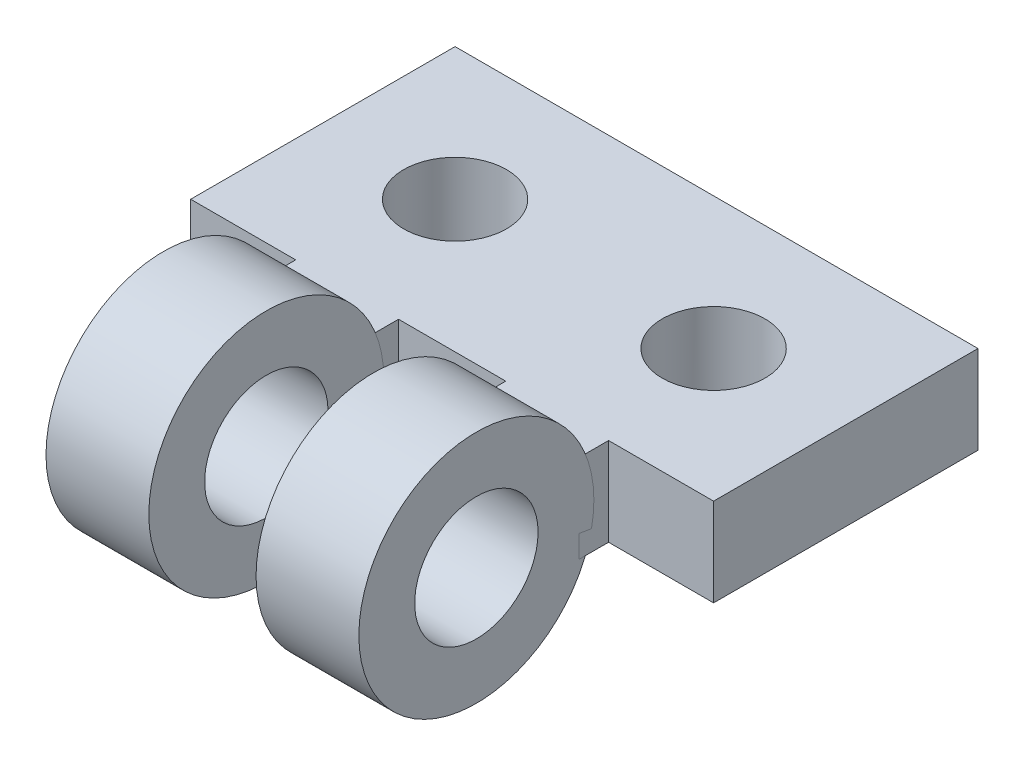
ISO-10303-21;
HEADER;
FILE_DESCRIPTION(('STEP AP214'),'2;1');
FILE_NAME('part.step','',(''),(''),'','','');
FILE_SCHEMA(('AUTOMOTIVE_DESIGN { 1 0 10303 214 1 1 1 1 }'));
ENDSEC;
DATA;
#1=APPLICATION_CONTEXT('core data for automotive mechanical design processes');
#2=APPLICATION_PROTOCOL_DEFINITION('international standard','automotive_design',2000,#1);
#3=PRODUCT_CONTEXT('',#1,'mechanical');
#4=PRODUCT('Part','Part','',(#3));
#5=PRODUCT_RELATED_PRODUCT_CATEGORY('part','',(#4));
#6=PRODUCT_DEFINITION_FORMATION('','',#4);
#7=PRODUCT_DEFINITION_CONTEXT('part definition',#1,'design');
#8=PRODUCT_DEFINITION('design','',#6,#7);
#9=PRODUCT_DEFINITION_SHAPE('','',#8);
#10=(LENGTH_UNIT() NAMED_UNIT(*) SI_UNIT(.MILLI.,.METRE.));
#11=(NAMED_UNIT(*) PLANE_ANGLE_UNIT() SI_UNIT($,.RADIAN.));
#12=(NAMED_UNIT(*) SI_UNIT($,.STERADIAN.) SOLID_ANGLE_UNIT());
#13=UNCERTAINTY_MEASURE_WITH_UNIT(LENGTH_MEASURE(1.E-05),#10,'distance_accuracy_value','');
#14=(GEOMETRIC_REPRESENTATION_CONTEXT(3) GLOBAL_UNCERTAINTY_ASSIGNED_CONTEXT((#13)) GLOBAL_UNIT_ASSIGNED_CONTEXT((#10,
#11,#12)) REPRESENTATION_CONTEXT('',''));
#15=CARTESIAN_POINT('',(0.,0.,0.));
#16=DIRECTION('',(0.,0.,1.));
#17=DIRECTION('',(1.,0.,0.));
#18=AXIS2_PLACEMENT_3D('',#15,#16,#17);
#19=CARTESIAN_POINT('',(-10.725,1.5,-13.5));
#20=DIRECTION('',(-1.,0.,0.));
#21=DIRECTION('',(0.,0.,1.));
#22=AXIS2_PLACEMENT_3D('',#19,#20,#21);
#23=PLANE('',#22);
#24=DIRECTION('',(0.,0.,1.));
#25=VECTOR('',#24,1.);
#26=CARTESIAN_POINT('',(-10.725,-1.5,-13.5));
#27=LINE('',#26,#25);
#28=CARTESIAN_POINT('',(-10.725,-1.5,-13.5));
#29=VERTEX_POINT('',#28);
#30=CARTESIAN_POINT('',(-10.725,-1.5,-4.5));
#31=VERTEX_POINT('',#30);
#32=EDGE_CURVE('E214',#29,#31,#27,.T.);
#33=ORIENTED_EDGE('',*,*,#32,.T.);
#34=DIRECTION('',(0.,1.,0.));
#35=VECTOR('',#34,1.);
#36=CARTESIAN_POINT('',(-10.725,4.70141143981152,-4.5));
#37=LINE('',#36,#35);
#38=CARTESIAN_POINT('',(-10.725,1.5,-4.5));
#39=VERTEX_POINT('',#38);
#40=EDGE_CURVE('E146',#31,#39,#37,.T.);
#41=ORIENTED_EDGE('',*,*,#40,.T.);
#42=DIRECTION('',(0.,0.,1.));
#43=VECTOR('',#42,1.);
#44=CARTESIAN_POINT('',(-10.725,1.5,-13.5));
#45=LINE('',#44,#43);
#46=CARTESIAN_POINT('',(-10.725,1.5,-13.5));
#47=VERTEX_POINT('',#46);
#48=EDGE_CURVE('E222',#47,#39,#45,.T.);
#49=ORIENTED_EDGE('',*,*,#48,.F.);
#50=DIRECTION('',(0.,-1.,0.));
#51=VECTOR('',#50,1.);
#52=CARTESIAN_POINT('',(-10.725,1.5,-13.5));
#53=LINE('',#52,#51);
#54=EDGE_CURVE('E205',#47,#29,#53,.T.);
#55=ORIENTED_EDGE('',*,*,#54,.T.);
#56=EDGE_LOOP('',(#33,#41,#49,#55));
#57=FACE_BOUND('',#56,.T.);
#58=ADVANCED_FACE('F53',(#57),#23,.T.);
#59=CARTESIAN_POINT('',(-10.725,1.5,-13.5));
#60=DIRECTION('',(0.,1.,0.));
#61=DIRECTION('',(0.,0.,1.));
#62=AXIS2_PLACEMENT_3D('',#59,#60,#61);
#63=PLANE('',#62);
#64=DIRECTION('',(-1.,0.,0.));
#65=VECTOR('',#64,1.);
#66=CARTESIAN_POINT('',(-10.725,1.5,-4.5));
#67=LINE('',#66,#65);
#68=CARTESIAN_POINT('',(-7.15,1.5,-4.5));
#69=VERTEX_POINT('',#68);
#70=EDGE_CURVE('E161',#69,#39,#67,.T.);
#71=ORIENTED_EDGE('',*,*,#70,.F.);
#72=DIRECTION('',(0.,0.,-1.));
#73=VECTOR('',#72,1.);
#74=CARTESIAN_POINT('',(-7.15,1.5,-13.5));
#75=LINE('',#74,#73);
#76=CARTESIAN_POINT('',(-7.15,1.5,-3.5));
#77=VERTEX_POINT('',#76);
#78=EDGE_CURVE('E153',#77,#69,#75,.T.);
#79=ORIENTED_EDGE('',*,*,#78,.F.);
#80=DIRECTION('',(-1.,0.,0.));
#81=VECTOR('',#80,1.);
#82=CARTESIAN_POINT('',(-10.725,1.5,-3.5));
#83=LINE('',#82,#81);
#84=CARTESIAN_POINT('',(-3.65,1.5,-3.5));
#85=VERTEX_POINT('',#84);
#86=EDGE_CURVE('E220',#85,#77,#83,.T.);
#87=ORIENTED_EDGE('',*,*,#86,.F.);
#88=DIRECTION('',(0.,0.,-1.));
#89=VECTOR('',#88,1.);
#90=CARTESIAN_POINT('',(-3.65,1.5,-13.5));
#91=LINE('',#90,#89);
#92=CARTESIAN_POINT('',(-3.65,1.5,-4.5));
#93=VERTEX_POINT('',#92);
#94=EDGE_CURVE('E77',#85,#93,#91,.T.);
#95=ORIENTED_EDGE('',*,*,#94,.T.);
#96=DIRECTION('',(1.,0.,0.));
#97=VECTOR('',#96,1.);
#98=CARTESIAN_POINT('',(-10.725,1.5,-4.5));
#99=LINE('',#98,#97);
#100=CARTESIAN_POINT('',(0.,1.5,-4.5));
#101=VERTEX_POINT('',#100);
#102=EDGE_CURVE('E179',#93,#101,#99,.T.);
#103=ORIENTED_EDGE('',*,*,#102,.T.);
#104=DIRECTION('',(0.,0.,1.));
#105=VECTOR('',#104,1.);
#106=CARTESIAN_POINT('',(0.,1.5,-13.5));
#107=LINE('',#106,#105);
#108=CARTESIAN_POINT('',(0.,1.5,-3.5));
#109=VERTEX_POINT('',#108);
#110=EDGE_CURVE('E180',#101,#109,#107,.T.);
#111=ORIENTED_EDGE('',*,*,#110,.T.);
#112=CARTESIAN_POINT('',(3.5,1.5,-3.5));
#113=VERTEX_POINT('',#112);
#114=EDGE_CURVE('E206',#113,#109,#83,.T.);
#115=ORIENTED_EDGE('',*,*,#114,.F.);
#116=DIRECTION('',(0.,0.,1.));
#117=VECTOR('',#116,1.);
#118=CARTESIAN_POINT('',(3.5,1.5,-13.5));
#119=LINE('',#118,#117);
#120=CARTESIAN_POINT('',(3.5,1.5,-4.5));
#121=VERTEX_POINT('',#120);
#122=EDGE_CURVE('E186',#121,#113,#119,.T.);
#123=ORIENTED_EDGE('',*,*,#122,.F.);
#124=DIRECTION('',(1.,0.,0.));
#125=VECTOR('',#124,1.);
#126=CARTESIAN_POINT('',(-10.725,1.5,-4.5));
#127=LINE('',#126,#125);
#128=CARTESIAN_POINT('',(7.075,1.5,-4.5));
#129=VERTEX_POINT('',#128);
#130=EDGE_CURVE('E195',#121,#129,#127,.T.);
#131=ORIENTED_EDGE('',*,*,#130,.T.);
#132=DIRECTION('',(0.,0.,1.));
#133=VECTOR('',#132,1.);
#134=CARTESIAN_POINT('',(7.075,1.5,-13.5));
#135=LINE('',#134,#133);
#136=CARTESIAN_POINT('',(7.075,1.5,-13.5));
#137=VERTEX_POINT('',#136);
#138=EDGE_CURVE('E223',#137,#129,#135,.T.);
#139=ORIENTED_EDGE('',*,*,#138,.F.);
#140=DIRECTION('',(-1.,0.,0.));
#141=VECTOR('',#140,1.);
#142=CARTESIAN_POINT('',(-10.725,1.5,-13.5));
#143=LINE('',#142,#141);
#144=EDGE_CURVE('E215',#137,#47,#143,.T.);
#145=ORIENTED_EDGE('',*,*,#144,.T.);
#146=ORIENTED_EDGE('',*,*,#48,.T.);
#147=EDGE_LOOP('',(#71,#79,#87,#95,#103,#111,#115,#123,#131,#139,#145,#146));
#148=FACE_BOUND('',#147,.T.);
#149=CARTESIAN_POINT('',(2.575,1.5,-9.));
#150=DIRECTION('',(0.,1.,0.));
#151=DIRECTION('',(0.,0.,1.));
#152=AXIS2_PLACEMENT_3D('',#149,#150,#151);
#153=CIRCLE('',#152,1.75);
#154=CARTESIAN_POINT('',(2.575,1.5,-7.25));
#155=VERTEX_POINT('',#154);
#156=EDGE_CURVE('E198',#155,#155,#153,.T.);
#157=ORIENTED_EDGE('',*,*,#156,.F.);
#158=EDGE_LOOP('',(#157));
#159=FACE_BOUND('',#158,.T.);
#160=CARTESIAN_POINT('',(-6.225,1.5,-9.));
#161=DIRECTION('',(0.,1.,0.));
#162=DIRECTION('',(0.,0.,-1.));
#163=AXIS2_PLACEMENT_3D('',#160,#161,#162);
#164=CIRCLE('',#163,1.75);
#165=CARTESIAN_POINT('',(-6.225,1.5,-10.75));
#166=VERTEX_POINT('',#165);
#167=EDGE_CURVE('E194',#166,#166,#164,.T.);
#168=ORIENTED_EDGE('',*,*,#167,.F.);
#169=EDGE_LOOP('',(#168));
#170=FACE_BOUND('',#169,.T.);
#171=ADVANCED_FACE('F251',(#148,#159,#170),#63,.T.);
#172=CARTESIAN_POINT('',(-10.725,-1.5,-13.5));
#173=DIRECTION('',(0.,-1.,0.));
#174=DIRECTION('',(0.,0.,-1.));
#175=AXIS2_PLACEMENT_3D('',#172,#173,#174);
#176=PLANE('',#175);
#177=DIRECTION('',(1.,0.,0.));
#178=VECTOR('',#177,1.);
#179=CARTESIAN_POINT('',(-10.725,-1.5,-4.5));
#180=LINE('',#179,#178);
#181=CARTESIAN_POINT('',(-7.15,-1.5,-4.5));
#182=VERTEX_POINT('',#181);
#183=EDGE_CURVE('E12',#31,#182,#180,.T.);
#184=ORIENTED_EDGE('',*,*,#183,.F.);
#185=ORIENTED_EDGE('',*,*,#32,.F.);
#186=DIRECTION('',(1.,0.,0.));
#187=VECTOR('',#186,1.);
#188=CARTESIAN_POINT('',(-10.725,-1.5,-13.5));
#189=LINE('',#188,#187);
#190=CARTESIAN_POINT('',(7.075,-1.5,-13.5));
#191=VERTEX_POINT('',#190);
#192=EDGE_CURVE('E202',#29,#191,#189,.T.);
#193=ORIENTED_EDGE('',*,*,#192,.T.);
#194=DIRECTION('',(0.,0.,1.));
#195=VECTOR('',#194,1.);
#196=CARTESIAN_POINT('',(7.075,-1.5,-13.5));
#197=LINE('',#196,#195);
#198=CARTESIAN_POINT('',(7.075,-1.5,-4.5));
#199=VERTEX_POINT('',#198);
#200=EDGE_CURVE('E228',#191,#199,#197,.T.);
#201=ORIENTED_EDGE('',*,*,#200,.T.);
#202=DIRECTION('',(-1.,0.,0.));
#203=VECTOR('',#202,1.);
#204=CARTESIAN_POINT('',(-10.725,-1.5,-4.5));
#205=LINE('',#204,#203);
#206=CARTESIAN_POINT('',(3.5,-1.5,-4.5));
#207=VERTEX_POINT('',#206);
#208=EDGE_CURVE('E239',#199,#207,#205,.T.);
#209=ORIENTED_EDGE('',*,*,#208,.T.);
#210=DIRECTION('',(0.,0.,-1.));
#211=VECTOR('',#210,1.);
#212=CARTESIAN_POINT('',(3.5,-1.5,-13.5));
#213=LINE('',#212,#211);
#214=CARTESIAN_POINT('',(3.5,-1.5,-3.5));
#215=VERTEX_POINT('',#214);
#216=EDGE_CURVE('E187',#215,#207,#213,.T.);
#217=ORIENTED_EDGE('',*,*,#216,.F.);
#218=DIRECTION('',(1.,0.,0.));
#219=VECTOR('',#218,1.);
#220=CARTESIAN_POINT('',(-10.725,-1.5,-3.5));
#221=LINE('',#220,#219);
#222=CARTESIAN_POINT('',(0.,-1.5,-3.5));
#223=VERTEX_POINT('',#222);
#224=EDGE_CURVE('E217',#223,#215,#221,.T.);
#225=ORIENTED_EDGE('',*,*,#224,.F.);
#226=DIRECTION('',(0.,0.,-1.));
#227=VECTOR('',#226,1.);
#228=CARTESIAN_POINT('',(0.,-1.5,-13.5));
#229=LINE('',#228,#227);
#230=CARTESIAN_POINT('',(0.,-1.5,-4.5));
#231=VERTEX_POINT('',#230);
#232=EDGE_CURVE('E174',#223,#231,#229,.T.);
#233=ORIENTED_EDGE('',*,*,#232,.T.);
#234=DIRECTION('',(-1.,0.,0.));
#235=VECTOR('',#234,1.);
#236=CARTESIAN_POINT('',(-10.725,-1.5,-4.5));
#237=LINE('',#236,#235);
#238=CARTESIAN_POINT('',(-3.65,-1.5,-4.5));
#239=VERTEX_POINT('',#238);
#240=EDGE_CURVE('E250',#231,#239,#237,.T.);
#241=ORIENTED_EDGE('',*,*,#240,.T.);
#242=DIRECTION('',(0.,0.,1.));
#243=VECTOR('',#242,1.);
#244=CARTESIAN_POINT('',(-3.65,-1.5,-13.5));
#245=LINE('',#244,#243);
#246=CARTESIAN_POINT('',(-3.65,-1.5,-3.5));
#247=VERTEX_POINT('',#246);
#248=EDGE_CURVE('E172',#239,#247,#245,.T.);
#249=ORIENTED_EDGE('',*,*,#248,.T.);
#250=CARTESIAN_POINT('',(-7.15,-1.5,-3.5));
#251=VERTEX_POINT('',#250);
#252=EDGE_CURVE('E157',#251,#247,#221,.T.);
#253=ORIENTED_EDGE('',*,*,#252,.F.);
#254=DIRECTION('',(0.,0.,1.));
#255=VECTOR('',#254,1.);
#256=CARTESIAN_POINT('',(-7.15,-1.5,-13.5));
#257=LINE('',#256,#255);
#258=EDGE_CURVE('E68',#182,#251,#257,.T.);
#259=ORIENTED_EDGE('',*,*,#258,.F.);
#260=EDGE_LOOP('',(#184,#185,#193,#201,#209,#217,#225,#233,#241,#249,#253,#259));
#261=FACE_BOUND('',#260,.T.);
#262=CARTESIAN_POINT('',(2.575,-1.5,-9.));
#263=DIRECTION('',(0.,-1.,0.));
#264=DIRECTION('',(0.,0.,-1.));
#265=AXIS2_PLACEMENT_3D('',#262,#263,#264);
#266=CIRCLE('',#265,1.75);
#267=CARTESIAN_POINT('',(2.575,-1.5,-10.75));
#268=VERTEX_POINT('',#267);
#269=EDGE_CURVE('E232',#268,#268,#266,.T.);
#270=ORIENTED_EDGE('',*,*,#269,.F.);
#271=EDGE_LOOP('',(#270));
#272=FACE_BOUND('',#271,.T.);
#273=CARTESIAN_POINT('',(-6.225,-1.5,-9.));
#274=DIRECTION('',(0.,-1.,0.));
#275=DIRECTION('',(0.,0.,-1.));
#276=AXIS2_PLACEMENT_3D('',#273,#274,#275);
#277=CIRCLE('',#276,1.75);
#278=CARTESIAN_POINT('',(-6.225,-1.5,-10.75));
#279=VERTEX_POINT('',#278);
#280=EDGE_CURVE('E200',#279,#279,#277,.T.);
#281=ORIENTED_EDGE('',*,*,#280,.F.);
#282=EDGE_LOOP('',(#281));
#283=FACE_BOUND('',#282,.T.);
#284=ADVANCED_FACE('F156',(#261,#272,#283),#176,.T.);
#285=CARTESIAN_POINT('',(0.,0.,-3.5));
#286=DIRECTION('',(0.,0.,1.));
#287=DIRECTION('',(1.,0.,0.));
#288=AXIS2_PLACEMENT_3D('',#285,#286,#287);
#289=PLANE('',#288);
#290=ORIENTED_EDGE('',*,*,#114,.T.);
#291=DIRECTION('',(0.,-1.,0.));
#292=VECTOR('',#291,1.);
#293=CARTESIAN_POINT('',(0.,0.,-3.5));
#294=LINE('',#293,#292);
#295=EDGE_CURVE('E244',#109,#223,#294,.T.);
#296=ORIENTED_EDGE('',*,*,#295,.T.);
#297=ORIENTED_EDGE('',*,*,#224,.T.);
#298=DIRECTION('',(0.,-1.,0.));
#299=VECTOR('',#298,1.);
#300=CARTESIAN_POINT('',(3.5,0.,-3.5));
#301=LINE('',#300,#299);
#302=EDGE_CURVE('E221',#113,#215,#301,.T.);
#303=ORIENTED_EDGE('',*,*,#302,.F.);
#304=EDGE_LOOP('',(#290,#296,#297,#303));
#305=FACE_BOUND('',#304,.T.);
#306=ADVANCED_FACE('F268',(#305),#289,.T.);
#307=DIRECTION('',(0.,1.,0.));
#308=VECTOR('',#307,1.);
#309=CARTESIAN_POINT('',(-7.15,0.,-3.5));
#310=LINE('',#309,#308);
#311=EDGE_CURVE('E62',#251,#77,#310,.T.);
#312=ORIENTED_EDGE('',*,*,#311,.F.);
#313=ORIENTED_EDGE('',*,*,#252,.T.);
#314=DIRECTION('',(0.,1.,0.));
#315=VECTOR('',#314,1.);
#316=CARTESIAN_POINT('',(-3.65,0.,-3.5));
#317=LINE('',#316,#315);
#318=EDGE_CURVE('E245',#247,#85,#317,.T.);
#319=ORIENTED_EDGE('',*,*,#318,.T.);
#320=ORIENTED_EDGE('',*,*,#86,.T.);
#321=EDGE_LOOP('',(#312,#313,#319,#320));
#322=FACE_BOUND('',#321,.T.);
#323=ADVANCED_FACE('F254',(#322),#289,.T.);
#324=CARTESIAN_POINT('',(7.075,1.5,-13.5));
#325=DIRECTION('',(1.,0.,0.));
#326=DIRECTION('',(0.,0.,-1.));
#327=AXIS2_PLACEMENT_3D('',#324,#325,#326);
#328=PLANE('',#327);
#329=DIRECTION('',(0.,1.,0.));
#330=VECTOR('',#329,1.);
#331=CARTESIAN_POINT('',(7.075,4.70141143981152,-4.5));
#332=LINE('',#331,#330);
#333=EDGE_CURVE('E184',#199,#129,#332,.T.);
#334=ORIENTED_EDGE('',*,*,#333,.F.);
#335=ORIENTED_EDGE('',*,*,#200,.F.);
#336=DIRECTION('',(0.,1.,0.));
#337=VECTOR('',#336,1.);
#338=CARTESIAN_POINT('',(7.075,1.5,-13.5));
#339=LINE('',#338,#337);
#340=EDGE_CURVE('E207',#191,#137,#339,.T.);
#341=ORIENTED_EDGE('',*,*,#340,.T.);
#342=ORIENTED_EDGE('',*,*,#138,.T.);
#343=EDGE_LOOP('',(#334,#335,#341,#342));
#344=FACE_BOUND('',#343,.T.);
#345=ADVANCED_FACE('F280',(#344),#328,.T.);
#346=CARTESIAN_POINT('',(0.,0.,-13.5));
#347=DIRECTION('',(0.,0.,1.));
#348=DIRECTION('',(1.,0.,0.));
#349=AXIS2_PLACEMENT_3D('',#346,#347,#348);
#350=PLANE('',#349);
#351=ORIENTED_EDGE('',*,*,#54,.F.);
#352=ORIENTED_EDGE('',*,*,#144,.F.);
#353=ORIENTED_EDGE('',*,*,#340,.F.);
#354=ORIENTED_EDGE('',*,*,#192,.F.);
#355=EDGE_LOOP('',(#351,#352,#353,#354));
#356=FACE_BOUND('',#355,.T.);
#357=ADVANCED_FACE('F285',(#356),#350,.F.);
#358=CARTESIAN_POINT('',(-6.225,-4.,-9.));
#359=DIRECTION('',(0.,1.,0.));
#360=DIRECTION('',(0.,0.,1.));
#361=AXIS2_PLACEMENT_3D('',#358,#359,#360);
#362=CYLINDRICAL_SURFACE('',#361,1.75);
#363=ORIENTED_EDGE('',*,*,#280,.T.);
#364=EDGE_LOOP('',(#363));
#365=FACE_BOUND('',#364,.T.);
#366=ORIENTED_EDGE('',*,*,#167,.T.);
#367=EDGE_LOOP('',(#366));
#368=FACE_BOUND('',#367,.T.);
#369=ADVANCED_FACE('F303',(#365,#368),#362,.F.);
#370=CARTESIAN_POINT('',(2.575,-4.,-9.));
#371=DIRECTION('',(0.,1.,0.));
#372=DIRECTION('',(0.,0.,1.));
#373=AXIS2_PLACEMENT_3D('',#370,#371,#372);
#374=CYLINDRICAL_SURFACE('',#373,1.75);
#375=ORIENTED_EDGE('',*,*,#269,.T.);
#376=EDGE_LOOP('',(#375));
#377=FACE_BOUND('',#376,.T.);
#378=ORIENTED_EDGE('',*,*,#156,.T.);
#379=EDGE_LOOP('',(#378));
#380=FACE_BOUND('',#379,.T.);
#381=ADVANCED_FACE('F359',(#377,#380),#374,.F.);
#382=CARTESIAN_POINT('',(7.075,4.70141143981152,-4.5));
#383=DIRECTION('',(0.,0.,1.));
#384=DIRECTION('',(1.,0.,0.));
#385=AXIS2_PLACEMENT_3D('',#382,#383,#384);
#386=PLANE('',#385);
#387=DIRECTION('',(0.,1.,0.));
#388=VECTOR('',#387,1.);
#389=CARTESIAN_POINT('',(3.5,4.70141143981152,-4.5));
#390=LINE('',#389,#388);
#391=EDGE_CURVE('E181',#207,#121,#390,.T.);
#392=ORIENTED_EDGE('',*,*,#391,.F.);
#393=ORIENTED_EDGE('',*,*,#208,.F.);
#394=ORIENTED_EDGE('',*,*,#333,.T.);
#395=ORIENTED_EDGE('',*,*,#130,.F.);
#396=EDGE_LOOP('',(#392,#393,#394,#395));
#397=FACE_BOUND('',#396,.T.);
#398=ADVANCED_FACE('F274',(#397),#386,.T.);
#399=CARTESIAN_POINT('',(3.5,0.,0.));
#400=DIRECTION('',(-1.,0.,0.));
#401=DIRECTION('',(0.,0.,1.));
#402=AXIS2_PLACEMENT_3D('',#399,#400,#401);
#403=PLANE('',#402);
#404=ORIENTED_EDGE('',*,*,#122,.T.);
#405=ORIENTED_EDGE('',*,*,#302,.T.);
#406=ORIENTED_EDGE('',*,*,#216,.T.);
#407=ORIENTED_EDGE('',*,*,#391,.T.);
#408=EDGE_LOOP('',(#404,#405,#406,#407));
#409=FACE_BOUND('',#408,.T.);
#410=ADVANCED_FACE('F271',(#409),#403,.F.);
#411=CARTESIAN_POINT('',(0.,0.,0.));
#412=DIRECTION('',(-1.,0.,0.));
#413=DIRECTION('',(0.,0.,1.));
#414=AXIS2_PLACEMENT_3D('',#411,#412,#413);
#415=PLANE('',#414);
#416=DIRECTION('',(0.,-1.,0.));
#417=VECTOR('',#416,1.);
#418=CARTESIAN_POINT('',(0.,4.66395637937762,-4.5));
#419=LINE('',#418,#417);
#420=EDGE_CURVE('E167',#101,#231,#419,.T.);
#421=ORIENTED_EDGE('',*,*,#420,.T.);
#422=ORIENTED_EDGE('',*,*,#232,.F.);
#423=ORIENTED_EDGE('',*,*,#295,.F.);
#424=ORIENTED_EDGE('',*,*,#110,.F.);
#425=EDGE_LOOP('',(#421,#422,#423,#424));
#426=FACE_BOUND('',#425,.T.);
#427=ADVANCED_FACE('F263',(#426),#415,.T.);
#428=CARTESIAN_POINT('',(-16.6503119457663,4.66395637937762,-4.5));
#429=DIRECTION('',(0.,0.,1.));
#430=DIRECTION('',(0.,-1.,0.));
#431=AXIS2_PLACEMENT_3D('',#428,#429,#430);
#432=PLANE('',#431);
#433=DIRECTION('',(0.,1.,0.));
#434=VECTOR('',#433,1.);
#435=CARTESIAN_POINT('',(-3.65,4.66395637937762,-4.5));
#436=LINE('',#435,#434);
#437=EDGE_CURVE('E166',#239,#93,#436,.T.);
#438=ORIENTED_EDGE('',*,*,#437,.F.);
#439=ORIENTED_EDGE('',*,*,#240,.F.);
#440=ORIENTED_EDGE('',*,*,#420,.F.);
#441=ORIENTED_EDGE('',*,*,#102,.F.);
#442=EDGE_LOOP('',(#438,#439,#440,#441));
#443=FACE_BOUND('',#442,.T.);
#444=ADVANCED_FACE('F261',(#443),#432,.T.);
#445=CARTESIAN_POINT('',(-3.65,0.,0.));
#446=DIRECTION('',(1.,0.,0.));
#447=DIRECTION('',(0.,0.,-1.));
#448=AXIS2_PLACEMENT_3D('',#445,#446,#447);
#449=PLANE('',#448);
#450=ORIENTED_EDGE('',*,*,#318,.F.);
#451=ORIENTED_EDGE('',*,*,#248,.F.);
#452=ORIENTED_EDGE('',*,*,#437,.T.);
#453=ORIENTED_EDGE('',*,*,#94,.F.);
#454=EDGE_LOOP('',(#450,#451,#452,#453));
#455=FACE_BOUND('',#454,.T.);
#456=ADVANCED_FACE('F258',(#455),#449,.T.);
#457=CARTESIAN_POINT('',(-10.725,4.70141143981152,-4.5));
#458=DIRECTION('',(0.,0.,-1.));
#459=DIRECTION('',(-1.,0.,0.));
#460=AXIS2_PLACEMENT_3D('',#457,#458,#459);
#461=PLANE('',#460);
#462=ORIENTED_EDGE('',*,*,#70,.T.);
#463=ORIENTED_EDGE('',*,*,#40,.F.);
#464=ORIENTED_EDGE('',*,*,#183,.T.);
#465=DIRECTION('',(0.,1.,0.));
#466=VECTOR('',#465,1.);
#467=CARTESIAN_POINT('',(-7.15,4.70141143981152,-4.5));
#468=LINE('',#467,#466);
#469=EDGE_CURVE('E144',#182,#69,#468,.T.);
#470=ORIENTED_EDGE('',*,*,#469,.T.);
#471=EDGE_LOOP('',(#462,#463,#464,#470));
#472=FACE_BOUND('',#471,.T.);
#473=ADVANCED_FACE('F145',(#472),#461,.F.);
#474=CARTESIAN_POINT('',(-7.15,0.,0.));
#475=DIRECTION('',(1.,0.,0.));
#476=DIRECTION('',(0.,0.,1.));
#477=AXIS2_PLACEMENT_3D('',#474,#475,#476);
#478=PLANE('',#477);
#479=ORIENTED_EDGE('',*,*,#78,.T.);
#480=ORIENTED_EDGE('',*,*,#469,.F.);
#481=ORIENTED_EDGE('',*,*,#258,.T.);
#482=ORIENTED_EDGE('',*,*,#311,.T.);
#483=EDGE_LOOP('',(#479,#480,#481,#482));
#484=FACE_BOUND('',#483,.T.);
#485=ADVANCED_FACE('F151',(#484),#478,.F.);
#486=CLOSED_SHELL('',(#58,#171,#284,#306,#323,#345,#357,#369,#381,#398,#410,#427,#444,#456,#473,#485));
#487=MANIFOLD_SOLID_BREP('B2',#486);
#488=CARTESIAN_POINT('',(-3.65,0.,0.));
#489=DIRECTION('',(1.,0.,0.));
#490=DIRECTION('',(0.,0.,-1.));
#491=AXIS2_PLACEMENT_3D('',#488,#489,#490);
#492=PLANE('',#491);
#493=CARTESIAN_POINT('',(-3.65,0.,0.));
#494=DIRECTION('',(1.,0.,0.));
#495=DIRECTION('',(0.,0.,-1.));
#496=AXIS2_PLACEMENT_3D('',#493,#494,#495);
#497=CIRCLE('',#496,4.);
#498=CARTESIAN_POINT('',(-3.65,0.,-4.));
#499=VERTEX_POINT('',#498);
#500=EDGE_CURVE('E52',#499,#499,#497,.T.);
#501=ORIENTED_EDGE('',*,*,#500,.T.);
#502=EDGE_LOOP('',(#501));
#503=FACE_BOUND('',#502,.T.);
#504=CARTESIAN_POINT('',(-3.65,0.,0.));
#505=DIRECTION('',(1.,0.,0.));
#506=DIRECTION('',(0.,0.,-1.));
#507=AXIS2_PLACEMENT_3D('',#504,#505,#506);
#508=CIRCLE('',#507,2.1);
#509=CARTESIAN_POINT('',(-3.65,0.,-2.1));
#510=VERTEX_POINT('',#509);
#511=EDGE_CURVE('E444',#510,#510,#508,.T.);
#512=ORIENTED_EDGE('',*,*,#511,.F.);
#513=EDGE_LOOP('',(#512));
#514=FACE_BOUND('',#513,.T.);
#515=ADVANCED_FACE('F435',(#503,#514),#492,.T.);
#516=CARTESIAN_POINT('',(-7.15,0.,0.));
#517=DIRECTION('',(1.,0.,0.));
#518=DIRECTION('',(0.,0.,-1.));
#519=AXIS2_PLACEMENT_3D('',#516,#517,#518);
#520=PLANE('',#519);
#521=CARTESIAN_POINT('',(-7.15,0.,0.));
#522=DIRECTION('',(1.,0.,0.));
#523=DIRECTION('',(0.,0.,-1.));
#524=AXIS2_PLACEMENT_3D('',#521,#522,#523);
#525=CIRCLE('',#524,4.);
#526=CARTESIAN_POINT('',(-7.15,0.,-4.));
#527=VERTEX_POINT('',#526);
#528=EDGE_CURVE('E436',#527,#527,#525,.T.);
#529=ORIENTED_EDGE('',*,*,#528,.F.);
#530=EDGE_LOOP('',(#529));
#531=FACE_BOUND('',#530,.T.);
#532=CARTESIAN_POINT('',(-7.15,0.,0.));
#533=DIRECTION('',(1.,0.,0.));
#534=DIRECTION('',(0.,0.,-1.));
#535=AXIS2_PLACEMENT_3D('',#532,#533,#534);
#536=CIRCLE('',#535,2.1);
#537=CARTESIAN_POINT('',(-7.15,0.,-2.1));
#538=VERTEX_POINT('',#537);
#539=EDGE_CURVE('E443',#538,#538,#536,.T.);
#540=ORIENTED_EDGE('',*,*,#539,.T.);
#541=EDGE_LOOP('',(#540));
#542=FACE_BOUND('',#541,.T.);
#543=ADVANCED_FACE('F454',(#531,#542),#520,.F.);
#544=CARTESIAN_POINT('',(-3.65,0.,0.));
#545=DIRECTION('',(-1.,0.,0.));
#546=DIRECTION('',(0.,0.,1.));
#547=AXIS2_PLACEMENT_3D('',#544,#545,#546);
#548=CYLINDRICAL_SURFACE('',#547,4.);
#549=ORIENTED_EDGE('',*,*,#500,.F.);
#550=EDGE_LOOP('',(#549));
#551=FACE_BOUND('',#550,.T.);
#552=ORIENTED_EDGE('',*,*,#528,.T.);
#553=EDGE_LOOP('',(#552));
#554=FACE_BOUND('',#553,.T.);
#555=ADVANCED_FACE('F432',(#551,#554),#548,.T.);
#556=CARTESIAN_POINT('',(-3.65,0.,0.));
#557=DIRECTION('',(-1.,0.,0.));
#558=DIRECTION('',(0.,0.,1.));
#559=AXIS2_PLACEMENT_3D('',#556,#557,#558);
#560=CYLINDRICAL_SURFACE('',#559,2.1);
#561=ORIENTED_EDGE('',*,*,#511,.T.);
#562=EDGE_LOOP('',(#561));
#563=FACE_BOUND('',#562,.T.);
#564=ORIENTED_EDGE('',*,*,#539,.F.);
#565=EDGE_LOOP('',(#564));
#566=FACE_BOUND('',#565,.T.);
#567=ADVANCED_FACE('F451',(#563,#566),#560,.F.);
#568=CLOSED_SHELL('',(#515,#543,#555,#567));
#569=MANIFOLD_SOLID_BREP('B6',#568);
#570=CARTESIAN_POINT('',(3.5,0.,0.));
#571=DIRECTION('',(1.,0.,0.));
#572=DIRECTION('',(0.,0.,-1.));
#573=AXIS2_PLACEMENT_3D('',#570,#571,#572);
#574=PLANE('',#573);
#575=CARTESIAN_POINT('',(3.5,0.,0.));
#576=DIRECTION('',(1.,0.,0.));
#577=DIRECTION('',(0.,0.,-1.));
#578=AXIS2_PLACEMENT_3D('',#575,#576,#577);
#579=CIRCLE('',#578,4.);
#580=CARTESIAN_POINT('',(3.5,0.,-4.));
#581=VERTEX_POINT('',#580);
#582=EDGE_CURVE('E431',#581,#581,#579,.T.);
#583=ORIENTED_EDGE('',*,*,#582,.T.);
#584=EDGE_LOOP('',(#583));
#585=FACE_BOUND('',#584,.T.);
#586=CARTESIAN_POINT('',(3.5,0.,0.));
#587=DIRECTION('',(1.,0.,0.));
#588=DIRECTION('',(0.,0.,-1.));
#589=AXIS2_PLACEMENT_3D('',#586,#587,#588);
#590=CIRCLE('',#589,2.1);
#591=CARTESIAN_POINT('',(3.5,0.,-2.1));
#592=VERTEX_POINT('',#591);
#593=EDGE_CURVE('E501',#592,#592,#590,.T.);
#594=ORIENTED_EDGE('',*,*,#593,.F.);
#595=EDGE_LOOP('',(#594));
#596=FACE_BOUND('',#595,.T.);
#597=ADVANCED_FACE('F493',(#585,#596),#574,.T.);
#598=CARTESIAN_POINT('',(0.,0.,0.));
#599=DIRECTION('',(1.,0.,0.));
#600=DIRECTION('',(0.,0.,-1.));
#601=AXIS2_PLACEMENT_3D('',#598,#599,#600);
#602=PLANE('',#601);
#603=CARTESIAN_POINT('',(0.,0.,0.));
#604=DIRECTION('',(1.,0.,0.));
#605=DIRECTION('',(0.,0.,-1.));
#606=AXIS2_PLACEMENT_3D('',#603,#604,#605);
#607=CIRCLE('',#606,4.);
#608=CARTESIAN_POINT('',(0.,0.,-4.));
#609=VERTEX_POINT('',#608);
#610=EDGE_CURVE('E499',#609,#609,#607,.T.);
#611=ORIENTED_EDGE('',*,*,#610,.F.);
#612=EDGE_LOOP('',(#611));
#613=FACE_BOUND('',#612,.T.);
#614=CARTESIAN_POINT('',(0.,0.,0.));
#615=DIRECTION('',(1.,0.,0.));
#616=DIRECTION('',(0.,0.,-1.));
#617=AXIS2_PLACEMENT_3D('',#614,#615,#616);
#618=CIRCLE('',#617,2.1);
#619=CARTESIAN_POINT('',(0.,0.,-2.1));
#620=VERTEX_POINT('',#619);
#621=EDGE_CURVE('E510',#620,#620,#618,.T.);
#622=ORIENTED_EDGE('',*,*,#621,.T.);
#623=EDGE_LOOP('',(#622));
#624=FACE_BOUND('',#623,.T.);
#625=ADVANCED_FACE('F520',(#613,#624),#602,.F.);
#626=CARTESIAN_POINT('',(3.5,0.,0.));
#627=DIRECTION('',(-1.,0.,0.));
#628=DIRECTION('',(0.,0.,1.));
#629=AXIS2_PLACEMENT_3D('',#626,#627,#628);
#630=CYLINDRICAL_SURFACE('',#629,4.);
#631=ORIENTED_EDGE('',*,*,#582,.F.);
#632=EDGE_LOOP('',(#631));
#633=FACE_BOUND('',#632,.T.);
#634=ORIENTED_EDGE('',*,*,#610,.T.);
#635=EDGE_LOOP('',(#634));
#636=FACE_BOUND('',#635,.T.);
#637=ADVANCED_FACE('F497',(#633,#636),#630,.T.);
#638=CARTESIAN_POINT('',(3.5,0.,0.));
#639=DIRECTION('',(-1.,0.,0.));
#640=DIRECTION('',(0.,0.,1.));
#641=AXIS2_PLACEMENT_3D('',#638,#639,#640);
#642=CYLINDRICAL_SURFACE('',#641,2.1);
#643=ORIENTED_EDGE('',*,*,#593,.T.);
#644=EDGE_LOOP('',(#643));
#645=FACE_BOUND('',#644,.T.);
#646=ORIENTED_EDGE('',*,*,#621,.F.);
#647=EDGE_LOOP('',(#646));
#648=FACE_BOUND('',#647,.T.);
#649=ADVANCED_FACE('F511',(#645,#648),#642,.F.);
#650=CLOSED_SHELL('',(#597,#625,#637,#649));
#651=MANIFOLD_SOLID_BREP('B48',#650);
#652=ADVANCED_BREP_SHAPE_REPRESENTATION('',(#18,#487,#569,#651),#14);
#653=SHAPE_DEFINITION_REPRESENTATION(#9,#652);
ENDSEC;
END-ISO-10303-21;
